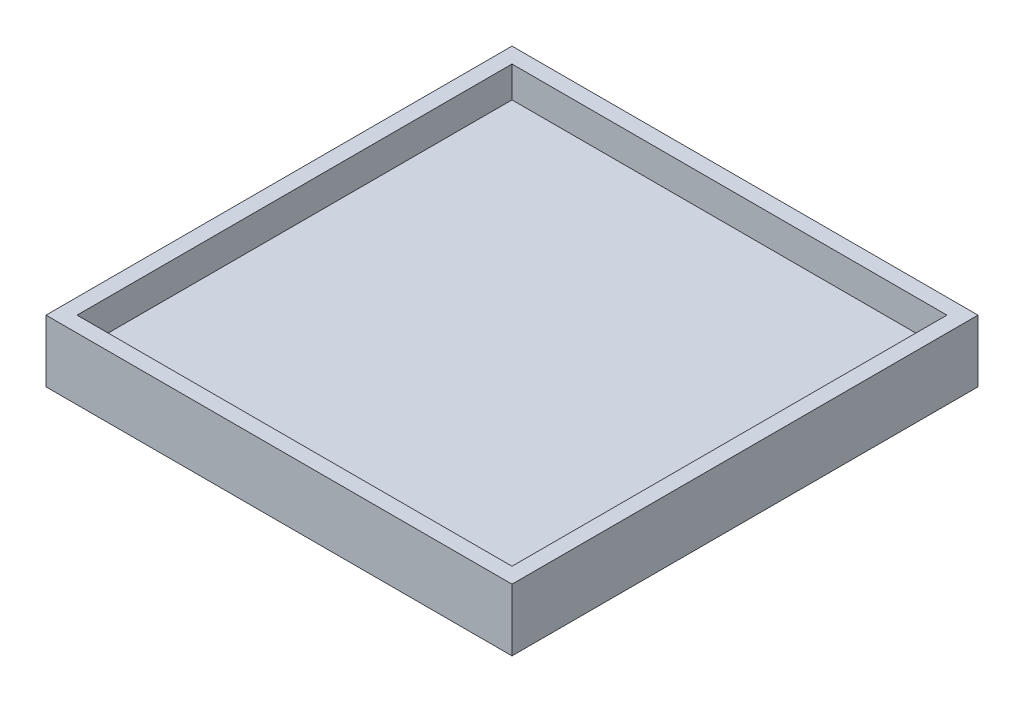
ISO-10303-21;
HEADER;
FILE_DESCRIPTION(('STEP AP214'),'2;1');
FILE_NAME('part.step','',(''),(''),'','','');
FILE_SCHEMA(('AUTOMOTIVE_DESIGN { 1 0 10303 214 1 1 1 1 }'));
ENDSEC;
DATA;
#1=APPLICATION_CONTEXT('core data for automotive mechanical design processes');
#2=APPLICATION_PROTOCOL_DEFINITION('international standard','automotive_design',2000,#1);
#3=PRODUCT_CONTEXT('',#1,'mechanical');
#4=PRODUCT('Part','Part','',(#3));
#5=PRODUCT_RELATED_PRODUCT_CATEGORY('part','',(#4));
#6=PRODUCT_DEFINITION_FORMATION('','',#4);
#7=PRODUCT_DEFINITION_CONTEXT('part definition',#1,'design');
#8=PRODUCT_DEFINITION('design','',#6,#7);
#9=PRODUCT_DEFINITION_SHAPE('','',#8);
#10=(LENGTH_UNIT() NAMED_UNIT(*) SI_UNIT(.MILLI.,.METRE.));
#11=(NAMED_UNIT(*) PLANE_ANGLE_UNIT() SI_UNIT($,.RADIAN.));
#12=(NAMED_UNIT(*) SI_UNIT($,.STERADIAN.) SOLID_ANGLE_UNIT());
#13=UNCERTAINTY_MEASURE_WITH_UNIT(LENGTH_MEASURE(1.E-05),#10,'distance_accuracy_value','');
#14=(GEOMETRIC_REPRESENTATION_CONTEXT(3) GLOBAL_UNCERTAINTY_ASSIGNED_CONTEXT((#13)) GLOBAL_UNIT_ASSIGNED_CONTEXT((#10,
#11,#12)) REPRESENTATION_CONTEXT('',''));
#15=CARTESIAN_POINT('',(0.,0.,0.));
#16=DIRECTION('',(0.,0.,1.));
#17=DIRECTION('',(1.,0.,0.));
#18=AXIS2_PLACEMENT_3D('',#15,#16,#17);
#19=CARTESIAN_POINT('',(-36.5412095913756,10.16,35.6874430121379));
#20=DIRECTION('',(-1.,0.,0.));
#21=DIRECTION('',(0.,0.,1.));
#22=AXIS2_PLACEMENT_3D('',#19,#20,#21);
#23=PLANE('',#22);
#24=DIRECTION('',(0.,0.,-1.));
#25=VECTOR('',#24,1.);
#26=CARTESIAN_POINT('',(-36.5412095913756,0.,35.6874430121379));
#27=LINE('',#26,#25);
#28=CARTESIAN_POINT('',(-36.5412095913756,0.,35.6874430121379));
#29=VERTEX_POINT('',#28);
#30=CARTESIAN_POINT('',(-36.5412095913756,0.,-40.5125569878621));
#31=VERTEX_POINT('',#30);
#32=EDGE_CURVE('E149',#29,#31,#27,.T.);
#33=ORIENTED_EDGE('',*,*,#32,.F.);
#34=DIRECTION('',(0.,-1.,0.));
#35=VECTOR('',#34,1.);
#36=CARTESIAN_POINT('',(-36.5412095913756,10.16,35.6874430121379));
#37=LINE('',#36,#35);
#38=CARTESIAN_POINT('',(-36.5412095913756,10.16,35.6874430121379));
#39=VERTEX_POINT('',#38);
#40=EDGE_CURVE('E11',#39,#29,#37,.T.);
#41=ORIENTED_EDGE('',*,*,#40,.F.);
#42=DIRECTION('',(0.,0.,-1.));
#43=VECTOR('',#42,1.);
#44=CARTESIAN_POINT('',(-36.5412095913756,10.16,35.6874430121379));
#45=LINE('',#44,#43);
#46=CARTESIAN_POINT('',(-36.5412095913756,10.16,-40.5125569878621));
#47=VERTEX_POINT('',#46);
#48=EDGE_CURVE('E153',#39,#47,#45,.T.);
#49=ORIENTED_EDGE('',*,*,#48,.T.);
#50=DIRECTION('',(0.,-1.,0.));
#51=VECTOR('',#50,1.);
#52=CARTESIAN_POINT('',(-36.5412095913756,10.16,-40.5125569878621));
#53=LINE('',#52,#51);
#54=EDGE_CURVE('E46',#47,#31,#53,.T.);
#55=ORIENTED_EDGE('',*,*,#54,.T.);
#56=EDGE_LOOP('',(#33,#41,#49,#55));
#57=FACE_BOUND('',#56,.T.);
#58=ADVANCED_FACE('F43',(#57),#23,.T.);
#59=CARTESIAN_POINT('',(-36.5412095913756,10.16,35.6874430121379));
#60=DIRECTION('',(0.,0.,-1.));
#61=DIRECTION('',(-1.,0.,0.));
#62=AXIS2_PLACEMENT_3D('',#59,#60,#61);
#63=PLANE('',#62);
#64=DIRECTION('',(1.,0.,0.));
#65=VECTOR('',#64,1.);
#66=CARTESIAN_POINT('',(-36.5412095913756,0.,35.6874430121379));
#67=LINE('',#66,#65);
#68=CARTESIAN_POINT('',(39.6587904086244,0.,35.6874430121379));
#69=VERTEX_POINT('',#68);
#70=EDGE_CURVE('E156',#29,#69,#67,.T.);
#71=ORIENTED_EDGE('',*,*,#70,.T.);
#72=DIRECTION('',(0.,-1.,0.));
#73=VECTOR('',#72,1.);
#74=CARTESIAN_POINT('',(39.6587904086244,10.16,35.6874430121379));
#75=LINE('',#74,#73);
#76=CARTESIAN_POINT('',(39.6587904086244,10.16,35.6874430121379));
#77=VERTEX_POINT('',#76);
#78=EDGE_CURVE('E51',#77,#69,#75,.T.);
#79=ORIENTED_EDGE('',*,*,#78,.F.);
#80=DIRECTION('',(1.,0.,0.));
#81=VECTOR('',#80,1.);
#82=CARTESIAN_POINT('',(-36.5412095913756,10.16,35.6874430121379));
#83=LINE('',#82,#81);
#84=EDGE_CURVE('E160',#39,#77,#83,.T.);
#85=ORIENTED_EDGE('',*,*,#84,.F.);
#86=ORIENTED_EDGE('',*,*,#40,.T.);
#87=EDGE_LOOP('',(#71,#79,#85,#86));
#88=FACE_BOUND('',#87,.T.);
#89=ADVANCED_FACE('F180',(#88),#63,.F.);
#90=CARTESIAN_POINT('',(39.6587904086244,10.16,35.6874430121379));
#91=DIRECTION('',(-1.,0.,0.));
#92=DIRECTION('',(0.,0.,1.));
#93=AXIS2_PLACEMENT_3D('',#90,#91,#92);
#94=PLANE('',#93);
#95=DIRECTION('',(0.,0.,-1.));
#96=VECTOR('',#95,1.);
#97=CARTESIAN_POINT('',(39.6587904086244,0.,35.6874430121379));
#98=LINE('',#97,#96);
#99=CARTESIAN_POINT('',(39.6587904086244,0.,-40.5125569878621));
#100=VERTEX_POINT('',#99);
#101=EDGE_CURVE('E167',#69,#100,#98,.T.);
#102=ORIENTED_EDGE('',*,*,#101,.T.);
#103=DIRECTION('',(0.,-1.,0.));
#104=VECTOR('',#103,1.);
#105=CARTESIAN_POINT('',(39.6587904086244,10.16,-40.5125569878621));
#106=LINE('',#105,#104);
#107=CARTESIAN_POINT('',(39.6587904086244,10.16,-40.5125569878621));
#108=VERTEX_POINT('',#107);
#109=EDGE_CURVE('E172',#108,#100,#106,.T.);
#110=ORIENTED_EDGE('',*,*,#109,.F.);
#111=DIRECTION('',(0.,0.,-1.));
#112=VECTOR('',#111,1.);
#113=CARTESIAN_POINT('',(39.6587904086244,10.16,35.6874430121379));
#114=LINE('',#113,#112);
#115=EDGE_CURVE('E158',#77,#108,#114,.T.);
#116=ORIENTED_EDGE('',*,*,#115,.F.);
#117=ORIENTED_EDGE('',*,*,#78,.T.);
#118=EDGE_LOOP('',(#102,#110,#116,#117));
#119=FACE_BOUND('',#118,.T.);
#120=ADVANCED_FACE('F183',(#119),#94,.F.);
#121=CARTESIAN_POINT('',(-36.5412095913756,10.16,-40.5125569878621));
#122=DIRECTION('',(0.,0.,-1.));
#123=DIRECTION('',(-1.,0.,0.));
#124=AXIS2_PLACEMENT_3D('',#121,#122,#123);
#125=PLANE('',#124);
#126=DIRECTION('',(1.,0.,0.));
#127=VECTOR('',#126,1.);
#128=CARTESIAN_POINT('',(-36.5412095913756,0.,-40.5125569878621));
#129=LINE('',#128,#127);
#130=EDGE_CURVE('E164',#31,#100,#129,.T.);
#131=ORIENTED_EDGE('',*,*,#130,.F.);
#132=ORIENTED_EDGE('',*,*,#54,.F.);
#133=DIRECTION('',(1.,0.,0.));
#134=VECTOR('',#133,1.);
#135=CARTESIAN_POINT('',(-36.5412095913756,10.16,-40.5125569878621));
#136=LINE('',#135,#134);
#137=EDGE_CURVE('E155',#47,#108,#136,.T.);
#138=ORIENTED_EDGE('',*,*,#137,.T.);
#139=ORIENTED_EDGE('',*,*,#109,.T.);
#140=EDGE_LOOP('',(#131,#132,#138,#139));
#141=FACE_BOUND('',#140,.T.);
#142=ADVANCED_FACE('F175',(#141),#125,.T.);
#143=CARTESIAN_POINT('',(0.,10.16,0.));
#144=DIRECTION('',(0.,-1.,0.));
#145=DIRECTION('',(0.,0.,-1.));
#146=AXIS2_PLACEMENT_3D('',#143,#144,#145);
#147=PLANE('',#146);
#148=DIRECTION('',(1.,0.,0.));
#149=VECTOR('',#148,1.);
#150=CARTESIAN_POINT('',(-34.0012095913756,10.16,33.1474430121379));
#151=LINE('',#150,#149);
#152=CARTESIAN_POINT('',(-34.0012095913756,10.16,33.1474430121379));
#153=VERTEX_POINT('',#152);
#154=CARTESIAN_POINT('',(37.1187904086244,10.16,33.1474430121379));
#155=VERTEX_POINT('',#154);
#156=EDGE_CURVE('E143',#153,#155,#151,.T.);
#157=ORIENTED_EDGE('',*,*,#156,.F.);
#158=DIRECTION('',(0.,0.,1.));
#159=VECTOR('',#158,1.);
#160=CARTESIAN_POINT('',(-34.0012095913756,10.16,-37.9725569878621));
#161=LINE('',#160,#159);
#162=CARTESIAN_POINT('',(-34.0012095913756,10.16,-37.9725569878621));
#163=VERTEX_POINT('',#162);
#164=EDGE_CURVE('E59',#163,#153,#161,.T.);
#165=ORIENTED_EDGE('',*,*,#164,.F.);
#166=DIRECTION('',(-1.,0.,0.));
#167=VECTOR('',#166,1.);
#168=CARTESIAN_POINT('',(-34.0012095913756,10.16,-37.9725569878621));
#169=LINE('',#168,#167);
#170=CARTESIAN_POINT('',(37.1187904086243,10.16,-37.9725569878621));
#171=VERTEX_POINT('',#170);
#172=EDGE_CURVE('E134',#171,#163,#169,.T.);
#173=ORIENTED_EDGE('',*,*,#172,.F.);
#174=DIRECTION('',(0.,0.,-1.));
#175=VECTOR('',#174,1.);
#176=CARTESIAN_POINT('',(37.1187904086243,10.16,-37.9725569878621));
#177=LINE('',#176,#175);
#178=EDGE_CURVE('E137',#155,#171,#177,.T.);
#179=ORIENTED_EDGE('',*,*,#178,.F.);
#180=EDGE_LOOP('',(#157,#165,#173,#179));
#181=FACE_BOUND('',#180,.T.);
#182=ORIENTED_EDGE('',*,*,#48,.F.);
#183=ORIENTED_EDGE('',*,*,#84,.T.);
#184=ORIENTED_EDGE('',*,*,#115,.T.);
#185=ORIENTED_EDGE('',*,*,#137,.F.);
#186=EDGE_LOOP('',(#182,#183,#184,#185));
#187=FACE_BOUND('',#186,.T.);
#188=ADVANCED_FACE('F185',(#181,#187),#147,.F.);
#189=CARTESIAN_POINT('',(0.,0.,0.));
#190=DIRECTION('',(0.,-1.,0.));
#191=DIRECTION('',(0.,0.,-1.));
#192=AXIS2_PLACEMENT_3D('',#189,#190,#191);
#193=PLANE('',#192);
#194=ORIENTED_EDGE('',*,*,#32,.T.);
#195=ORIENTED_EDGE('',*,*,#130,.T.);
#196=ORIENTED_EDGE('',*,*,#101,.F.);
#197=ORIENTED_EDGE('',*,*,#70,.F.);
#198=EDGE_LOOP('',(#194,#195,#196,#197));
#199=FACE_BOUND('',#198,.T.);
#200=ADVANCED_FACE('F178',(#199),#193,.T.);
#201=CARTESIAN_POINT('',(-34.0012095913756,5.08,-37.9725569878621));
#202=DIRECTION('',(-1.,0.,0.));
#203=DIRECTION('',(0.,0.,1.));
#204=AXIS2_PLACEMENT_3D('',#201,#202,#203);
#205=PLANE('',#204);
#206=ORIENTED_EDGE('',*,*,#164,.T.);
#207=DIRECTION('',(0.,1.,0.));
#208=VECTOR('',#207,1.);
#209=CARTESIAN_POINT('',(-34.0012095913756,5.08,33.1474430121379));
#210=LINE('',#209,#208);
#211=CARTESIAN_POINT('',(-34.0012095913756,5.08,33.1474430121379));
#212=VERTEX_POINT('',#211);
#213=EDGE_CURVE('E112',#212,#153,#210,.T.);
#214=ORIENTED_EDGE('',*,*,#213,.F.);
#215=DIRECTION('',(0.,0.,1.));
#216=VECTOR('',#215,1.);
#217=CARTESIAN_POINT('',(-34.0012095913756,5.08,-37.9725569878621));
#218=LINE('',#217,#216);
#219=CARTESIAN_POINT('',(-34.0012095913756,5.08,-37.9725569878621));
#220=VERTEX_POINT('',#219);
#221=EDGE_CURVE('E116',#220,#212,#218,.T.);
#222=ORIENTED_EDGE('',*,*,#221,.F.);
#223=DIRECTION('',(0.,1.,0.));
#224=VECTOR('',#223,1.);
#225=CARTESIAN_POINT('',(-34.0012095913756,5.08,-37.9725569878621));
#226=LINE('',#225,#224);
#227=EDGE_CURVE('E147',#220,#163,#226,.T.);
#228=ORIENTED_EDGE('',*,*,#227,.T.);
#229=EDGE_LOOP('',(#206,#214,#222,#228));
#230=FACE_BOUND('',#229,.T.);
#231=ADVANCED_FACE('F114',(#230),#205,.F.);
#232=CARTESIAN_POINT('',(-34.0012095913756,5.08,-37.9725569878621));
#233=DIRECTION('',(0.,0.,-1.));
#234=DIRECTION('',(-1.,0.,0.));
#235=AXIS2_PLACEMENT_3D('',#232,#233,#234);
#236=PLANE('',#235);
#237=ORIENTED_EDGE('',*,*,#172,.T.);
#238=ORIENTED_EDGE('',*,*,#227,.F.);
#239=DIRECTION('',(-1.,0.,0.));
#240=VECTOR('',#239,1.);
#241=CARTESIAN_POINT('',(-34.0012095913756,5.08,-37.9725569878621));
#242=LINE('',#241,#240);
#243=CARTESIAN_POINT('',(37.1187904086243,5.08,-37.9725569878621));
#244=VERTEX_POINT('',#243);
#245=EDGE_CURVE('E122',#244,#220,#242,.T.);
#246=ORIENTED_EDGE('',*,*,#245,.F.);
#247=DIRECTION('',(0.,1.,0.));
#248=VECTOR('',#247,1.);
#249=CARTESIAN_POINT('',(37.1187904086243,5.08,-37.9725569878621));
#250=LINE('',#249,#248);
#251=EDGE_CURVE('E150',#244,#171,#250,.T.);
#252=ORIENTED_EDGE('',*,*,#251,.T.);
#253=EDGE_LOOP('',(#237,#238,#246,#252));
#254=FACE_BOUND('',#253,.T.);
#255=ADVANCED_FACE('F229',(#254),#236,.F.);
#256=CARTESIAN_POINT('',(37.1187904086243,5.08,-37.9725569878621));
#257=DIRECTION('',(1.,0.,0.));
#258=DIRECTION('',(0.,0.,-1.));
#259=AXIS2_PLACEMENT_3D('',#256,#257,#258);
#260=PLANE('',#259);
#261=ORIENTED_EDGE('',*,*,#178,.T.);
#262=ORIENTED_EDGE('',*,*,#251,.F.);
#263=DIRECTION('',(0.,0.,-1.));
#264=VECTOR('',#263,1.);
#265=CARTESIAN_POINT('',(37.1187904086243,5.08,-37.9725569878621));
#266=LINE('',#265,#264);
#267=CARTESIAN_POINT('',(37.1187904086244,5.08,33.1474430121379));
#268=VERTEX_POINT('',#267);
#269=EDGE_CURVE('E130',#268,#244,#266,.T.);
#270=ORIENTED_EDGE('',*,*,#269,.F.);
#271=DIRECTION('',(0.,1.,0.));
#272=VECTOR('',#271,1.);
#273=CARTESIAN_POINT('',(37.1187904086244,5.08,33.1474430121379));
#274=LINE('',#273,#272);
#275=EDGE_CURVE('E121',#268,#155,#274,.T.);
#276=ORIENTED_EDGE('',*,*,#275,.T.);
#277=EDGE_LOOP('',(#261,#262,#270,#276));
#278=FACE_BOUND('',#277,.T.);
#279=ADVANCED_FACE('F237',(#278),#260,.F.);
#280=CARTESIAN_POINT('',(-34.0012095913756,5.08,33.1474430121379));
#281=DIRECTION('',(0.,0.,1.));
#282=DIRECTION('',(1.,0.,0.));
#283=AXIS2_PLACEMENT_3D('',#280,#281,#282);
#284=PLANE('',#283);
#285=ORIENTED_EDGE('',*,*,#156,.T.);
#286=ORIENTED_EDGE('',*,*,#275,.F.);
#287=DIRECTION('',(1.,0.,0.));
#288=VECTOR('',#287,1.);
#289=CARTESIAN_POINT('',(-34.0012095913756,5.08,33.1474430121379));
#290=LINE('',#289,#288);
#291=EDGE_CURVE('E125',#212,#268,#290,.T.);
#292=ORIENTED_EDGE('',*,*,#291,.F.);
#293=ORIENTED_EDGE('',*,*,#213,.T.);
#294=EDGE_LOOP('',(#285,#286,#292,#293));
#295=FACE_BOUND('',#294,.T.);
#296=ADVANCED_FACE('F126',(#295),#284,.F.);
#297=CARTESIAN_POINT('',(0.,5.08,0.));
#298=DIRECTION('',(0.,1.,0.));
#299=DIRECTION('',(0.,0.,1.));
#300=AXIS2_PLACEMENT_3D('',#297,#298,#299);
#301=PLANE('',#300);
#302=ORIENTED_EDGE('',*,*,#221,.T.);
#303=ORIENTED_EDGE('',*,*,#291,.T.);
#304=ORIENTED_EDGE('',*,*,#269,.T.);
#305=ORIENTED_EDGE('',*,*,#245,.T.);
#306=EDGE_LOOP('',(#302,#303,#304,#305));
#307=FACE_BOUND('',#306,.T.);
#308=ADVANCED_FACE('F132',(#307),#301,.T.);
#309=CLOSED_SHELL('',(#58,#89,#120,#142,#188,#200,#231,#255,#279,#296,#308));
#310=MANIFOLD_SOLID_BREP('B2',#309);
#311=ADVANCED_BREP_SHAPE_REPRESENTATION('',(#18,#310),#14);
#312=SHAPE_DEFINITION_REPRESENTATION(#9,#311);
ENDSEC;
END-ISO-10303-21;
